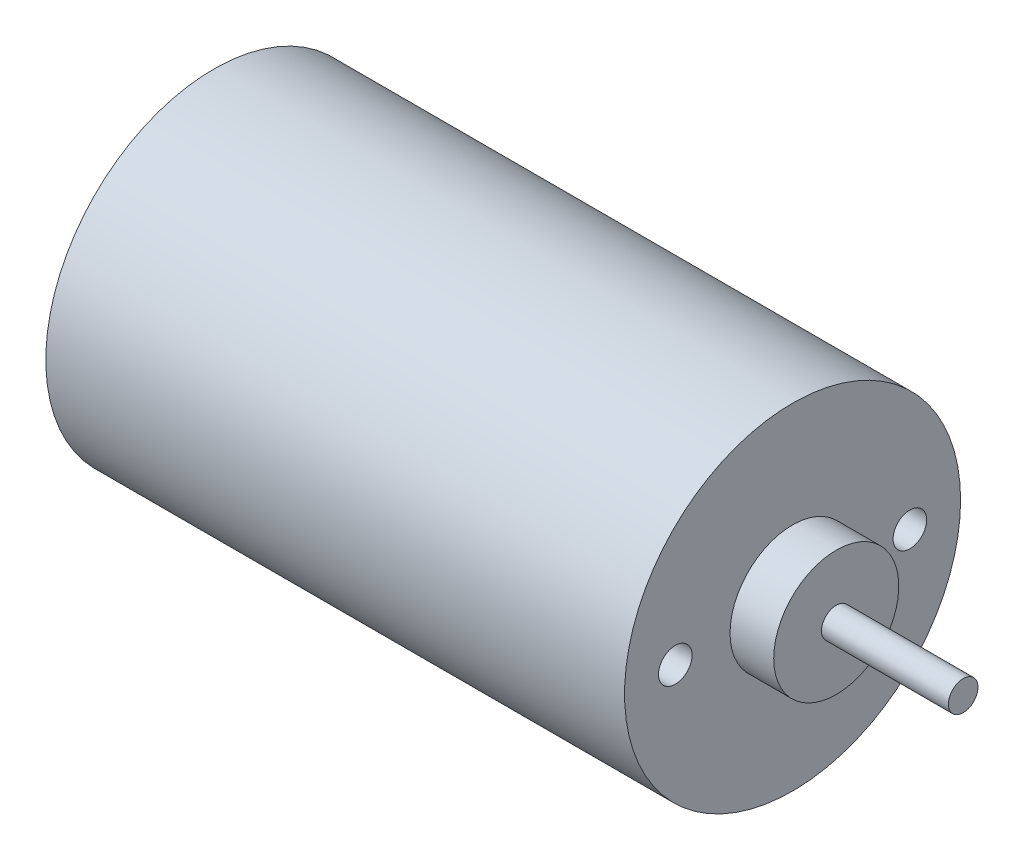
ISO-10303-21;
HEADER;
FILE_DESCRIPTION(('STEP AP214'),'2;1');
FILE_NAME('part.step','',(''),(''),'','','');
FILE_SCHEMA(('AUTOMOTIVE_DESIGN { 1 0 10303 214 1 1 1 1 }'));
ENDSEC;
DATA;
#1=APPLICATION_CONTEXT('core data for automotive mechanical design processes');
#2=APPLICATION_PROTOCOL_DEFINITION('international standard','automotive_design',2000,#1);
#3=PRODUCT_CONTEXT('',#1,'mechanical');
#4=PRODUCT('Part','Part','',(#3));
#5=PRODUCT_RELATED_PRODUCT_CATEGORY('part','',(#4));
#6=PRODUCT_DEFINITION_FORMATION('','',#4);
#7=PRODUCT_DEFINITION_CONTEXT('part definition',#1,'design');
#8=PRODUCT_DEFINITION('design','',#6,#7);
#9=PRODUCT_DEFINITION_SHAPE('','',#8);
#10=(LENGTH_UNIT() NAMED_UNIT(*) SI_UNIT(.MILLI.,.METRE.));
#11=(NAMED_UNIT(*) PLANE_ANGLE_UNIT() SI_UNIT($,.RADIAN.));
#12=(NAMED_UNIT(*) SI_UNIT($,.STERADIAN.) SOLID_ANGLE_UNIT());
#13=UNCERTAINTY_MEASURE_WITH_UNIT(LENGTH_MEASURE(1.E-05),#10,'distance_accuracy_value','');
#14=(GEOMETRIC_REPRESENTATION_CONTEXT(3) GLOBAL_UNCERTAINTY_ASSIGNED_CONTEXT((#13)) GLOBAL_UNIT_ASSIGNED_CONTEXT((#10,
#11,#12)) REPRESENTATION_CONTEXT('',''));
#15=CARTESIAN_POINT('',(0.,0.,0.));
#16=DIRECTION('',(0.,0.,1.));
#17=DIRECTION('',(1.,0.,0.));
#18=AXIS2_PLACEMENT_3D('',#15,#16,#17);
#19=CARTESIAN_POINT('',(62.,0.,0.));
#20=DIRECTION('',(-1.,0.,0.));
#21=DIRECTION('',(0.,0.,1.));
#22=AXIS2_PLACEMENT_3D('',#19,#20,#21);
#23=CYLINDRICAL_SURFACE('',#22,18.);
#24=CARTESIAN_POINT('',(62.,0.,0.));
#25=DIRECTION('',(1.,0.,0.));
#26=DIRECTION('',(0.,0.,-1.));
#27=AXIS2_PLACEMENT_3D('',#24,#25,#26);
#28=CIRCLE('',#27,18.);
#29=CARTESIAN_POINT('',(62.,0.,-18.));
#30=VERTEX_POINT('',#29);
#31=EDGE_CURVE('E12',#30,#30,#28,.T.);
#32=ORIENTED_EDGE('',*,*,#31,.F.);
#33=EDGE_LOOP('',(#32));
#34=FACE_BOUND('',#33,.T.);
#35=CARTESIAN_POINT('',(0.,0.,0.));
#36=DIRECTION('',(1.,0.,0.));
#37=DIRECTION('',(0.,0.,-1.));
#38=AXIS2_PLACEMENT_3D('',#35,#36,#37);
#39=CIRCLE('',#38,18.);
#40=CARTESIAN_POINT('',(0.,0.,-18.));
#41=VERTEX_POINT('',#40);
#42=EDGE_CURVE('E47',#41,#41,#39,.T.);
#43=ORIENTED_EDGE('',*,*,#42,.T.);
#44=EDGE_LOOP('',(#43));
#45=FACE_BOUND('',#44,.T.);
#46=ADVANCED_FACE('F44',(#34,#45),#23,.T.);
#47=CARTESIAN_POINT('',(62.,0.,0.));
#48=DIRECTION('',(1.,0.,0.));
#49=DIRECTION('',(0.,0.,-1.));
#50=AXIS2_PLACEMENT_3D('',#47,#48,#49);
#51=PLANE('',#50);
#52=CARTESIAN_POINT('',(62.,0.,-12.565));
#53=DIRECTION('',(1.,0.,0.));
#54=DIRECTION('',(0.,0.,-1.));
#55=AXIS2_PLACEMENT_3D('',#52,#53,#54);
#56=CIRCLE('',#55,1.8);
#57=CARTESIAN_POINT('',(62.,0.,-14.365));
#58=VERTEX_POINT('',#57);
#59=EDGE_CURVE('E74',#58,#58,#56,.T.);
#60=ORIENTED_EDGE('',*,*,#59,.F.);
#61=EDGE_LOOP('',(#60));
#62=FACE_BOUND('',#61,.T.);
#63=CARTESIAN_POINT('',(62.,0.,12.565));
#64=DIRECTION('',(1.,0.,0.));
#65=DIRECTION('',(0.,0.,-1.));
#66=AXIS2_PLACEMENT_3D('',#63,#64,#65);
#67=CIRCLE('',#66,1.8);
#68=CARTESIAN_POINT('',(62.,0.,10.765));
#69=VERTEX_POINT('',#68);
#70=EDGE_CURVE('E68',#69,#69,#67,.T.);
#71=ORIENTED_EDGE('',*,*,#70,.F.);
#72=EDGE_LOOP('',(#71));
#73=FACE_BOUND('',#72,.T.);
#74=CARTESIAN_POINT('',(62.,0.,0.));
#75=DIRECTION('',(1.,0.,0.));
#76=DIRECTION('',(0.,0.,-1.));
#77=AXIS2_PLACEMENT_3D('',#74,#75,#76);
#78=CIRCLE('',#77,6.7);
#79=CARTESIAN_POINT('',(62.,0.,6.7));
#80=VERTEX_POINT('',#79);
#81=EDGE_CURVE('E56',#80,#80,#78,.T.);
#82=ORIENTED_EDGE('',*,*,#81,.F.);
#83=EDGE_LOOP('',(#82));
#84=FACE_BOUND('',#83,.T.);
#85=ORIENTED_EDGE('',*,*,#31,.T.);
#86=EDGE_LOOP('',(#85));
#87=FACE_BOUND('',#86,.T.);
#88=ADVANCED_FACE('F89',(#62,#73,#84,#87),#51,.T.);
#89=CARTESIAN_POINT('',(0.,0.,0.));
#90=DIRECTION('',(1.,0.,0.));
#91=DIRECTION('',(0.,0.,-1.));
#92=AXIS2_PLACEMENT_3D('',#89,#90,#91);
#93=PLANE('',#92);
#94=ORIENTED_EDGE('',*,*,#42,.F.);
#95=EDGE_LOOP('',(#94));
#96=FACE_BOUND('',#95,.T.);
#97=ADVANCED_FACE('F92',(#96),#93,.F.);
#98=CARTESIAN_POINT('',(66.68,0.,0.));
#99=DIRECTION('',(-1.,0.,0.));
#100=DIRECTION('',(0.,0.,1.));
#101=AXIS2_PLACEMENT_3D('',#98,#99,#100);
#102=CYLINDRICAL_SURFACE('',#101,6.7);
#103=CARTESIAN_POINT('',(66.68,0.,0.));
#104=DIRECTION('',(1.,0.,0.));
#105=DIRECTION('',(0.,0.,-1.));
#106=AXIS2_PLACEMENT_3D('',#103,#104,#105);
#107=CIRCLE('',#106,6.7);
#108=CARTESIAN_POINT('',(66.68,0.,6.7));
#109=VERTEX_POINT('',#108);
#110=EDGE_CURVE('E54',#109,#109,#107,.T.);
#111=CARTESIAN_POINT('',(66.68,0.,6.7));
#112=CARTESIAN_POINT('',(66.63125,0.,6.7));
#113=CARTESIAN_POINT('',(66.5825,0.,6.7));
#114=CARTESIAN_POINT('',(66.485,0.,6.7));
#115=CARTESIAN_POINT('',(66.43625,0.,6.7));
#116=CARTESIAN_POINT('',(66.33875,0.,6.7));
#117=CARTESIAN_POINT('',(66.29,0.,6.7));
#118=CARTESIAN_POINT('',(66.1925,0.,6.7));
#119=CARTESIAN_POINT('',(66.14375,0.,6.7));
#120=CARTESIAN_POINT('',(66.04625,0.,6.7));
#121=CARTESIAN_POINT('',(65.9975,0.,6.7));
#122=CARTESIAN_POINT('',(65.9,0.,6.7));
#123=CARTESIAN_POINT('',(65.85125,0.,6.7));
#124=CARTESIAN_POINT('',(65.75375,0.,6.7));
#125=CARTESIAN_POINT('',(65.705,0.,6.7));
#126=CARTESIAN_POINT('',(65.6075,0.,6.7));
#127=CARTESIAN_POINT('',(65.55875,0.,6.7));
#128=CARTESIAN_POINT('',(65.46125,0.,6.7));
#129=CARTESIAN_POINT('',(65.4125,0.,6.7));
#130=CARTESIAN_POINT('',(65.315,0.,6.7));
#131=CARTESIAN_POINT('',(65.26625,0.,6.7));
#132=CARTESIAN_POINT('',(65.16875,0.,6.7));
#133=CARTESIAN_POINT('',(65.12,0.,6.7));
#134=CARTESIAN_POINT('',(65.0225,0.,6.7));
#135=CARTESIAN_POINT('',(64.97375,0.,6.7));
#136=CARTESIAN_POINT('',(64.87625,0.,6.7));
#137=CARTESIAN_POINT('',(64.8275,0.,6.7));
#138=CARTESIAN_POINT('',(64.73,0.,6.7));
#139=CARTESIAN_POINT('',(64.68125,0.,6.7));
#140=CARTESIAN_POINT('',(64.58375,0.,6.7));
#141=CARTESIAN_POINT('',(64.535,0.,6.7));
#142=CARTESIAN_POINT('',(64.4375,0.,6.7));
#143=CARTESIAN_POINT('',(64.38875,0.,6.7));
#144=CARTESIAN_POINT('',(64.29125,0.,6.7));
#145=CARTESIAN_POINT('',(64.2425,0.,6.7));
#146=CARTESIAN_POINT('',(64.145,0.,6.7));
#147=CARTESIAN_POINT('',(64.09625,0.,6.7));
#148=CARTESIAN_POINT('',(63.99875,0.,6.7));
#149=CARTESIAN_POINT('',(63.95,0.,6.7));
#150=CARTESIAN_POINT('',(63.8525,0.,6.7));
#151=CARTESIAN_POINT('',(63.80375,0.,6.7));
#152=CARTESIAN_POINT('',(63.70625,0.,6.7));
#153=CARTESIAN_POINT('',(63.6575,0.,6.7));
#154=CARTESIAN_POINT('',(63.56,0.,6.7));
#155=CARTESIAN_POINT('',(63.51125,0.,6.7));
#156=CARTESIAN_POINT('',(63.41375,0.,6.7));
#157=CARTESIAN_POINT('',(63.365,0.,6.7));
#158=CARTESIAN_POINT('',(63.2675,0.,6.7));
#159=CARTESIAN_POINT('',(63.21875,0.,6.7));
#160=CARTESIAN_POINT('',(63.12125,0.,6.7));
#161=CARTESIAN_POINT('',(63.0725,0.,6.7));
#162=CARTESIAN_POINT('',(62.975,0.,6.7));
#163=CARTESIAN_POINT('',(62.92625,0.,6.7));
#164=CARTESIAN_POINT('',(62.82875,0.,6.7));
#165=CARTESIAN_POINT('',(62.78,0.,6.7));
#166=CARTESIAN_POINT('',(62.6825,0.,6.7));
#167=CARTESIAN_POINT('',(62.63375,0.,6.7));
#168=CARTESIAN_POINT('',(62.53625,0.,6.7));
#169=CARTESIAN_POINT('',(62.4875,0.,6.7));
#170=CARTESIAN_POINT('',(62.39,0.,6.7));
#171=CARTESIAN_POINT('',(62.34125,0.,6.7));
#172=CARTESIAN_POINT('',(62.24375,0.,6.7));
#173=CARTESIAN_POINT('',(62.195,0.,6.7));
#174=CARTESIAN_POINT('',(62.0975,0.,6.7));
#175=CARTESIAN_POINT('',(62.04875,0.,6.7));
#176=CARTESIAN_POINT('',(62.,0.,6.7));
#177=B_SPLINE_CURVE_WITH_KNOTS('',3,(#111,#112,#113,#114,#115,#116,#117,#118,#119,#120,#121,
#122,#123,#124,#125,#126,#127,#128,#129,#130,#131,#132,#133,#134,#135,#136,#137,#138,#139,#140,
#141,#142,#143,#144,#145,#146,#147,#148,#149,#150,#151,#152,#153,#154,#155,#156,#157,#158,#159,
#160,#161,#162,#163,#164,#165,#166,#167,#168,#169,#170,#171,#172,#173,#174,#175,#176),
.UNSPECIFIED.,.F.,.F.,(4,2,2,2,2,2,2,2,2,2,2,2,2,2,2,2,2,2,2,2,2,2,2,2,2,2,2,2,2,2,2,2,4),(0.,
0.146249999999987,0.292499999999987,0.438749999999988,0.584999999999988,0.731249999999989,
0.877499999999989,1.02374999999999,1.16999999999999,1.31624999999999,1.46249999999999,
1.60874999999999,1.75499999999999,1.90124999999999,2.04749999999999,2.19374999999999,
2.33999999999999,2.48625,2.6325,2.77875,2.925,3.07125,3.2175,3.36375,3.51,3.65625,3.8025,
3.94875,4.09499999999999,4.24124999999999,4.3875,4.53375,4.68),.UNSPECIFIED.);
#178=EDGE_CURVE('BSEAM98',#109,#80,#177,.T.);
#179=ORIENTED_EDGE('',*,*,#110,.F.);
#180=ORIENTED_EDGE('',*,*,#81,.T.);
#181=ORIENTED_EDGE('',*,*,#178,.T.);
#182=ORIENTED_EDGE('',*,*,#178,.F.);
#183=EDGE_LOOP('',(#179,#181,#180,#182));
#184=FACE_BOUND('',#183,.T.);
#185=ADVANCED_FACE('F98',(#184),#102,.T.);
#186=CARTESIAN_POINT('',(66.68,0.,0.));
#187=DIRECTION('',(1.,0.,0.));
#188=DIRECTION('',(0.,0.,-1.));
#189=AXIS2_PLACEMENT_3D('',#186,#187,#188);
#190=PLANE('',#189);
#191=CARTESIAN_POINT('',(66.68,0.,0.));
#192=DIRECTION('',(1.,0.,0.));
#193=DIRECTION('',(0.,0.,-1.));
#194=AXIS2_PLACEMENT_3D('',#191,#192,#193);
#195=CIRCLE('',#194,1.585);
#196=CARTESIAN_POINT('',(66.68,0.,-1.585));
#197=VERTEX_POINT('',#196);
#198=EDGE_CURVE('E62',#197,#197,#195,.T.);
#199=ORIENTED_EDGE('',*,*,#198,.F.);
#200=EDGE_LOOP('',(#199));
#201=FACE_BOUND('',#200,.T.);
#202=ORIENTED_EDGE('',*,*,#110,.T.);
#203=EDGE_LOOP('',(#202));
#204=FACE_BOUND('',#203,.T.);
#205=ADVANCED_FACE('F100',(#201,#204),#190,.T.);
#206=CARTESIAN_POINT('',(80.28,0.,0.));
#207=DIRECTION('',(-1.,0.,0.));
#208=DIRECTION('',(0.,0.,1.));
#209=AXIS2_PLACEMENT_3D('',#206,#207,#208);
#210=CYLINDRICAL_SURFACE('',#209,1.585);
#211=CARTESIAN_POINT('',(80.28,0.,0.));
#212=DIRECTION('',(1.,0.,0.));
#213=DIRECTION('',(0.,0.,-1.));
#214=AXIS2_PLACEMENT_3D('',#211,#212,#213);
#215=CIRCLE('',#214,1.585);
#216=CARTESIAN_POINT('',(80.28,0.,-1.585));
#217=VERTEX_POINT('',#216);
#218=EDGE_CURVE('E59',#217,#217,#215,.T.);
#219=ORIENTED_EDGE('',*,*,#218,.F.);
#220=EDGE_LOOP('',(#219));
#221=FACE_BOUND('',#220,.T.);
#222=ORIENTED_EDGE('',*,*,#198,.T.);
#223=EDGE_LOOP('',(#222));
#224=FACE_BOUND('',#223,.T.);
#225=ADVANCED_FACE('F107',(#221,#224),#210,.T.);
#226=CARTESIAN_POINT('',(80.28,0.,0.));
#227=DIRECTION('',(1.,0.,0.));
#228=DIRECTION('',(0.,0.,-1.));
#229=AXIS2_PLACEMENT_3D('',#226,#227,#228);
#230=PLANE('',#229);
#231=ORIENTED_EDGE('',*,*,#218,.T.);
#232=EDGE_LOOP('',(#231));
#233=FACE_BOUND('',#232,.T.);
#234=ADVANCED_FACE('F148',(#233),#230,.T.);
#235=CARTESIAN_POINT('',(42.,0.,12.565));
#236=DIRECTION('',(1.,0.,0.));
#237=DIRECTION('',(0.,0.,-1.));
#238=AXIS2_PLACEMENT_3D('',#235,#236,#237);
#239=CYLINDRICAL_SURFACE('',#238,1.8);
#240=CARTESIAN_POINT('',(42.,0.,12.565));
#241=DIRECTION('',(1.,0.,0.));
#242=DIRECTION('',(0.,0.,-1.));
#243=AXIS2_PLACEMENT_3D('',#240,#241,#242);
#244=CIRCLE('',#243,1.8);
#245=CARTESIAN_POINT('',(42.,0.,10.765));
#246=VERTEX_POINT('',#245);
#247=EDGE_CURVE('E65',#246,#246,#244,.T.);
#248=ORIENTED_EDGE('',*,*,#247,.F.);
#249=EDGE_LOOP('',(#248));
#250=FACE_BOUND('',#249,.T.);
#251=ORIENTED_EDGE('',*,*,#70,.T.);
#252=EDGE_LOOP('',(#251));
#253=FACE_BOUND('',#252,.T.);
#254=ADVANCED_FACE('F157',(#250,#253),#239,.F.);
#255=CARTESIAN_POINT('',(42.,0.,12.565));
#256=DIRECTION('',(1.,0.,0.));
#257=DIRECTION('',(0.,0.,-1.));
#258=AXIS2_PLACEMENT_3D('',#255,#256,#257);
#259=PLANE('',#258);
#260=ORIENTED_EDGE('',*,*,#247,.T.);
#261=EDGE_LOOP('',(#260));
#262=FACE_BOUND('',#261,.T.);
#263=ADVANCED_FACE('F85',(#262),#259,.T.);
#264=CARTESIAN_POINT('',(42.,0.,-12.565));
#265=DIRECTION('',(1.,0.,0.));
#266=DIRECTION('',(0.,0.,-1.));
#267=AXIS2_PLACEMENT_3D('',#264,#265,#266);
#268=CYLINDRICAL_SURFACE('',#267,1.8);
#269=CARTESIAN_POINT('',(42.,0.,-12.565));
#270=DIRECTION('',(1.,0.,0.));
#271=DIRECTION('',(0.,0.,-1.));
#272=AXIS2_PLACEMENT_3D('',#269,#270,#271);
#273=CIRCLE('',#272,1.8);
#274=CARTESIAN_POINT('',(42.,0.,-14.365));
#275=VERTEX_POINT('',#274);
#276=EDGE_CURVE('E71',#275,#275,#273,.T.);
#277=ORIENTED_EDGE('',*,*,#276,.F.);
#278=EDGE_LOOP('',(#277));
#279=FACE_BOUND('',#278,.T.);
#280=ORIENTED_EDGE('',*,*,#59,.T.);
#281=EDGE_LOOP('',(#280));
#282=FACE_BOUND('',#281,.T.);
#283=ADVANCED_FACE('F82',(#279,#282),#268,.F.);
#284=CARTESIAN_POINT('',(42.,0.,-12.565));
#285=DIRECTION('',(1.,0.,0.));
#286=DIRECTION('',(0.,0.,-1.));
#287=AXIS2_PLACEMENT_3D('',#284,#285,#286);
#288=PLANE('',#287);
#289=ORIENTED_EDGE('',*,*,#276,.T.);
#290=EDGE_LOOP('',(#289));
#291=FACE_BOUND('',#290,.T.);
#292=ADVANCED_FACE('F80',(#291),#288,.T.);
#293=CLOSED_SHELL('',(#46,#88,#97,#185,#205,#225,#234,#254,#263,#283,#292));
#294=MANIFOLD_SOLID_BREP('B2',#293);
#295=ADVANCED_BREP_SHAPE_REPRESENTATION('',(#18,#294),#14);
#296=SHAPE_DEFINITION_REPRESENTATION(#9,#295);
ENDSEC;
END-ISO-10303-21;
